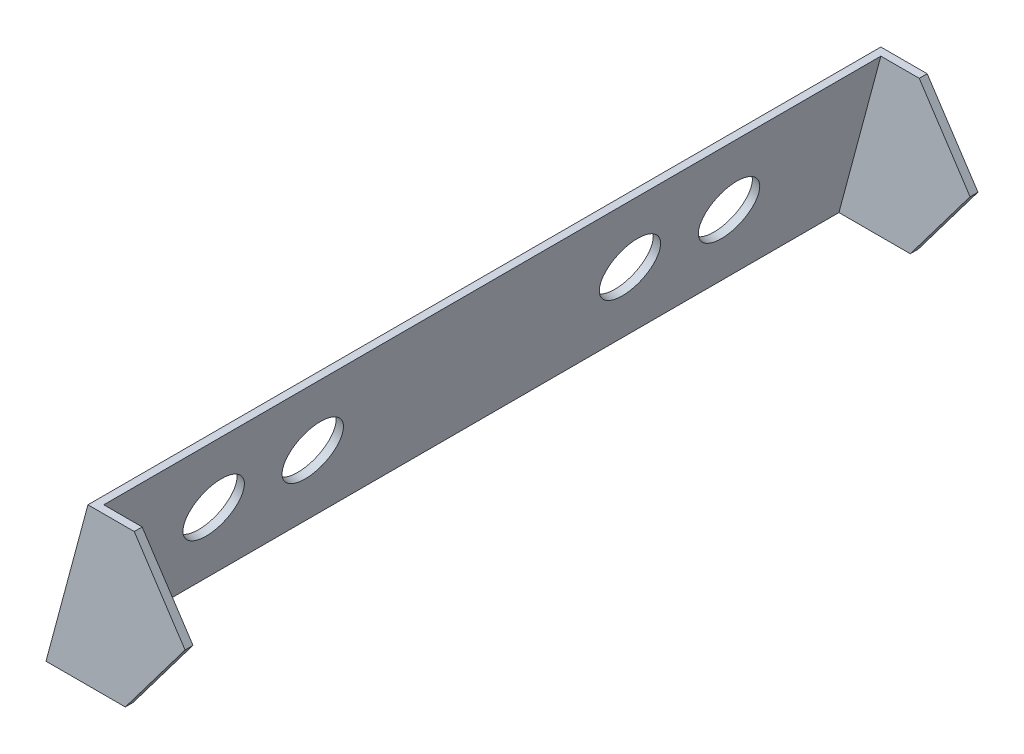
ISO-10303-21;
HEADER;
FILE_DESCRIPTION(('STEP AP214'),'2;1');
FILE_NAME('part.step','',(''),(''),'','','');
FILE_SCHEMA(('AUTOMOTIVE_DESIGN { 1 0 10303 214 1 1 1 1 }'));
ENDSEC;
DATA;
#1=APPLICATION_CONTEXT('core data for automotive mechanical design processes');
#2=APPLICATION_PROTOCOL_DEFINITION('international standard','automotive_design',2000,#1);
#3=PRODUCT_CONTEXT('',#1,'mechanical');
#4=PRODUCT('Part','Part','',(#3));
#5=PRODUCT_RELATED_PRODUCT_CATEGORY('part','',(#4));
#6=PRODUCT_DEFINITION_FORMATION('','',#4);
#7=PRODUCT_DEFINITION_CONTEXT('part definition',#1,'design');
#8=PRODUCT_DEFINITION('design','',#6,#7);
#9=PRODUCT_DEFINITION_SHAPE('','',#8);
#10=(LENGTH_UNIT() NAMED_UNIT(*) SI_UNIT(.MILLI.,.METRE.));
#11=(NAMED_UNIT(*) PLANE_ANGLE_UNIT() SI_UNIT($,.RADIAN.));
#12=(NAMED_UNIT(*) SI_UNIT($,.STERADIAN.) SOLID_ANGLE_UNIT());
#13=UNCERTAINTY_MEASURE_WITH_UNIT(LENGTH_MEASURE(1.E-05),#10,'distance_accuracy_value','');
#14=(GEOMETRIC_REPRESENTATION_CONTEXT(3) GLOBAL_UNCERTAINTY_ASSIGNED_CONTEXT((#13)) GLOBAL_UNIT_ASSIGNED_CONTEXT((#10,
#11,#12)) REPRESENTATION_CONTEXT('',''));
#15=CARTESIAN_POINT('',(0.,0.,0.));
#16=DIRECTION('',(0.,0.,1.));
#17=DIRECTION('',(1.,0.,0.));
#18=AXIS2_PLACEMENT_3D('',#15,#16,#17);
#19=CARTESIAN_POINT('',(0.,-20.,2.));
#20=DIRECTION('',(-0.965925826289069,0.258819045102518,0.));
#21=DIRECTION('',(-0.258819045102518,-0.965925826289069,0.));
#22=AXIS2_PLACEMENT_3D('',#19,#20,#21);
#23=PLANE('',#22);
#24=CARTESIAN_POINT('',(5.4210841017541,0.23176129985044,-163.));
#25=DIRECTION('',(-0.965925826289069,0.258819045102518,0.));
#26=DIRECTION('',(-0.258819045102518,-0.965925826289069,0.));
#27=AXIS2_PLACEMENT_3D('',#24,#25,#26);
#28=CIRCLE('',#27,7.50000000000001);
#29=CARTESIAN_POINT('',(3.47994126348521,-7.01268239731759,-163.));
#30=VERTEX_POINT('',#29);
#31=EDGE_CURVE('E138',#30,#30,#28,.T.);
#32=ORIENTED_EDGE('',*,*,#31,.F.);
#33=EDGE_LOOP('',(#32));
#34=FACE_BOUND('',#33,.T.);
#35=CARTESIAN_POINT('',(5.4210841017541,0.23176129985044,-33.));
#36=DIRECTION('',(-0.965925826289069,0.258819045102518,0.));
#37=DIRECTION('',(-0.258819045102518,-0.965925826289069,0.));
#38=AXIS2_PLACEMENT_3D('',#35,#36,#37);
#39=CIRCLE('',#38,7.50000000000001);
#40=CARTESIAN_POINT('',(3.47994126348521,-7.01268239731758,-33.));
#41=VERTEX_POINT('',#40);
#42=EDGE_CURVE('E239',#41,#41,#39,.T.);
#43=ORIENTED_EDGE('',*,*,#42,.F.);
#44=EDGE_LOOP('',(#43));
#45=FACE_BOUND('',#44,.T.);
#46=CARTESIAN_POINT('',(5.42108410175413,0.231761299850614,-138.));
#47=DIRECTION('',(-0.965925826289069,0.258819045102518,0.));
#48=DIRECTION('',(-0.258819045102518,-0.965925826289069,0.));
#49=AXIS2_PLACEMENT_3D('',#46,#47,#48);
#50=CIRCLE('',#49,7.50000000000001);
#51=CARTESIAN_POINT('',(3.47994126348524,-7.01268239731742,-138.));
#52=VERTEX_POINT('',#51);
#53=EDGE_CURVE('E243',#52,#52,#50,.T.);
#54=ORIENTED_EDGE('',*,*,#53,.F.);
#55=EDGE_LOOP('',(#54));
#56=FACE_BOUND('',#55,.T.);
#57=CARTESIAN_POINT('',(5.42108410175413,0.231761299850614,-58.));
#58=DIRECTION('',(-0.965925826289069,0.258819045102518,0.));
#59=DIRECTION('',(-0.258819045102518,-0.965925826289069,0.));
#60=AXIS2_PLACEMENT_3D('',#57,#58,#59);
#61=CIRCLE('',#60,7.50000000000001);
#62=CARTESIAN_POINT('',(3.47994126348524,-7.01268239731741,-58.));
#63=VERTEX_POINT('',#62);
#64=EDGE_CURVE('E246',#63,#63,#61,.T.);
#65=ORIENTED_EDGE('',*,*,#64,.F.);
#66=EDGE_LOOP('',(#65));
#67=FACE_BOUND('',#66,.T.);
#68=DIRECTION('',(0.,0.,-1.));
#69=VECTOR('',#68,1.);
#70=CARTESIAN_POINT('',(10.5742190110772,19.4635225997012,2.));
#71=LINE('',#70,#69);
#72=CARTESIAN_POINT('',(10.5742190110772,19.4635225997012,2.));
#73=VERTEX_POINT('',#72);
#74=CARTESIAN_POINT('',(10.5742190110772,19.4635225997012,-198.));
#75=VERTEX_POINT('',#74);
#76=EDGE_CURVE('E170',#73,#75,#71,.T.);
#77=ORIENTED_EDGE('',*,*,#76,.T.);
#78=DIRECTION('',(-0.258819045102518,-0.965925826289069,0.));
#79=VECTOR('',#78,1.);
#80=CARTESIAN_POINT('',(0.,-20.,-198.));
#81=LINE('',#80,#79);
#82=CARTESIAN_POINT('',(0.,-20.,-198.));
#83=VERTEX_POINT('',#82);
#84=EDGE_CURVE('E118',#75,#83,#81,.T.);
#85=ORIENTED_EDGE('',*,*,#84,.T.);
#86=DIRECTION('',(0.,0.,-1.));
#87=VECTOR('',#86,1.);
#88=CARTESIAN_POINT('',(0.,-20.,2.));
#89=LINE('',#88,#87);
#90=CARTESIAN_POINT('',(0.,-20.,2.));
#91=VERTEX_POINT('',#90);
#92=EDGE_CURVE('E112',#91,#83,#89,.T.);
#93=ORIENTED_EDGE('',*,*,#92,.F.);
#94=DIRECTION('',(0.258819045102518,0.965925826289069,0.));
#95=VECTOR('',#94,1.);
#96=CARTESIAN_POINT('',(0.,-20.,2.));
#97=LINE('',#96,#95);
#98=EDGE_CURVE('E157',#91,#73,#97,.T.);
#99=ORIENTED_EDGE('',*,*,#98,.T.);
#100=EDGE_LOOP('',(#77,#85,#93,#99));
#101=FACE_BOUND('',#100,.T.);
#102=ADVANCED_FACE('F33',(#34,#45,#56,#67,#101),#23,.T.);
#103=CARTESIAN_POINT('',(0.,-20.,2.));
#104=DIRECTION('',(0.,1.,0.));
#105=DIRECTION('',(0.,0.,1.));
#106=AXIS2_PLACEMENT_3D('',#103,#104,#105);
#107=PLANE('',#106);
#108=ORIENTED_EDGE('',*,*,#92,.T.);
#109=DIRECTION('',(1.,0.,0.));
#110=VECTOR('',#109,1.);
#111=CARTESIAN_POINT('',(2.,-20.,-198.));
#112=LINE('',#111,#110);
#113=CARTESIAN_POINT('',(20.,-20.,-198.));
#114=VERTEX_POINT('',#113);
#115=EDGE_CURVE('E106',#83,#114,#112,.T.);
#116=ORIENTED_EDGE('',*,*,#115,.T.);
#117=DIRECTION('',(0.,0.,1.));
#118=VECTOR('',#117,1.);
#119=CARTESIAN_POINT('',(20.,-20.,-198.));
#120=LINE('',#119,#118);
#121=CARTESIAN_POINT('',(20.,-20.,-196.));
#122=VERTEX_POINT('',#121);
#123=EDGE_CURVE('E109',#114,#122,#120,.T.);
#124=ORIENTED_EDGE('',*,*,#123,.T.);
#125=DIRECTION('',(1.,0.,0.));
#126=VECTOR('',#125,1.);
#127=CARTESIAN_POINT('',(0.,-20.,-196.));
#128=LINE('',#127,#126);
#129=CARTESIAN_POINT('',(2.,-20.,-196.));
#130=VERTEX_POINT('',#129);
#131=EDGE_CURVE('E141',#130,#122,#128,.T.);
#132=ORIENTED_EDGE('',*,*,#131,.F.);
#133=DIRECTION('',(0.,0.,1.));
#134=VECTOR('',#133,1.);
#135=CARTESIAN_POINT('',(2.,-20.,-198.));
#136=LINE('',#135,#134);
#137=CARTESIAN_POINT('',(2.,-20.,0.));
#138=VERTEX_POINT('',#137);
#139=EDGE_CURVE('E52',#130,#138,#136,.T.);
#140=ORIENTED_EDGE('',*,*,#139,.T.);
#141=DIRECTION('',(1.,0.,0.));
#142=VECTOR('',#141,1.);
#143=CARTESIAN_POINT('',(0.,-20.,0.));
#144=LINE('',#143,#142);
#145=CARTESIAN_POINT('',(20.,-20.,0.));
#146=VERTEX_POINT('',#145);
#147=EDGE_CURVE('E161',#138,#146,#144,.T.);
#148=ORIENTED_EDGE('',*,*,#147,.T.);
#149=DIRECTION('',(0.,0.,-1.));
#150=VECTOR('',#149,1.);
#151=CARTESIAN_POINT('',(20.,-20.,2.));
#152=LINE('',#151,#150);
#153=CARTESIAN_POINT('',(20.,-20.,2.));
#154=VERTEX_POINT('',#153);
#155=EDGE_CURVE('E180',#154,#146,#152,.T.);
#156=ORIENTED_EDGE('',*,*,#155,.F.);
#157=DIRECTION('',(1.,0.,0.));
#158=VECTOR('',#157,1.);
#159=CARTESIAN_POINT('',(0.,-20.,2.));
#160=LINE('',#159,#158);
#161=EDGE_CURVE('E168',#91,#154,#160,.T.);
#162=ORIENTED_EDGE('',*,*,#161,.F.);
#163=EDGE_LOOP('',(#108,#116,#124,#132,#140,#148,#156,#162));
#164=FACE_BOUND('',#163,.T.);
#165=ADVANCED_FACE('F108',(#164),#107,.F.);
#166=CARTESIAN_POINT('',(20.,-20.,2.));
#167=DIRECTION('',(-0.79853855454825,0.601943665885764,0.));
#168=DIRECTION('',(-0.601943665885764,-0.79853855454825,0.));
#169=AXIS2_PLACEMENT_3D('',#166,#167,#168);
#170=PLANE('',#169);
#171=DIRECTION('',(0.601943665885764,0.79853855454825,0.));
#172=VECTOR('',#171,1.);
#173=CARTESIAN_POINT('',(20.,-20.,0.));
#174=LINE('',#173,#172);
#175=CARTESIAN_POINT('',(35.0761328293359,0.,0.));
#176=VERTEX_POINT('',#175);
#177=EDGE_CURVE('E175',#146,#176,#174,.T.);
#178=ORIENTED_EDGE('',*,*,#177,.T.);
#179=DIRECTION('',(0.,0.,-1.));
#180=VECTOR('',#179,1.);
#181=CARTESIAN_POINT('',(35.0761328293359,0.,2.));
#182=LINE('',#181,#180);
#183=CARTESIAN_POINT('',(35.0761328293359,0.,2.));
#184=VERTEX_POINT('',#183);
#185=EDGE_CURVE('E183',#184,#176,#182,.T.);
#186=ORIENTED_EDGE('',*,*,#185,.F.);
#187=DIRECTION('',(0.601943665885764,0.79853855454825,0.));
#188=VECTOR('',#187,1.);
#189=CARTESIAN_POINT('',(20.,-20.,2.));
#190=LINE('',#189,#188);
#191=EDGE_CURVE('E166',#154,#184,#190,.T.);
#192=ORIENTED_EDGE('',*,*,#191,.F.);
#193=ORIENTED_EDGE('',*,*,#155,.T.);
#194=EDGE_LOOP('',(#178,#186,#192,#193));
#195=FACE_BOUND('',#194,.T.);
#196=ADVANCED_FACE('F198',(#195),#170,.F.);
#197=CARTESIAN_POINT('',(22.2565436344256,19.4635225997012,2.));
#198=DIRECTION('',(0.835128537813812,0.550054838474278,0.));
#199=DIRECTION('',(-0.550054838474278,0.835128537813812,0.));
#200=AXIS2_PLACEMENT_3D('',#197,#198,#199);
#201=PLANE('',#200);
#202=DIRECTION('',(0.550054838474278,-0.835128537813812,0.));
#203=VECTOR('',#202,1.);
#204=CARTESIAN_POINT('',(22.2565436344256,19.4635225997012,0.));
#205=LINE('',#204,#203);
#206=CARTESIAN_POINT('',(22.2565436344256,19.4635225997012,0.));
#207=VERTEX_POINT('',#206);
#208=EDGE_CURVE('E172',#207,#176,#205,.T.);
#209=ORIENTED_EDGE('',*,*,#208,.F.);
#210=DIRECTION('',(0.,0.,-1.));
#211=VECTOR('',#210,1.);
#212=CARTESIAN_POINT('',(22.2565436344256,19.4635225997012,2.));
#213=LINE('',#212,#211);
#214=CARTESIAN_POINT('',(22.2565436344256,19.4635225997012,2.));
#215=VERTEX_POINT('',#214);
#216=EDGE_CURVE('E185',#215,#207,#213,.T.);
#217=ORIENTED_EDGE('',*,*,#216,.F.);
#218=DIRECTION('',(0.550054838474278,-0.835128537813812,0.));
#219=VECTOR('',#218,1.);
#220=CARTESIAN_POINT('',(22.2565436344256,19.4635225997012,2.));
#221=LINE('',#220,#219);
#222=EDGE_CURVE('E163',#215,#184,#221,.T.);
#223=ORIENTED_EDGE('',*,*,#222,.T.);
#224=ORIENTED_EDGE('',*,*,#185,.T.);
#225=EDGE_LOOP('',(#209,#217,#223,#224));
#226=FACE_BOUND('',#225,.T.);
#227=ADVANCED_FACE('F290',(#226),#201,.T.);
#228=CARTESIAN_POINT('',(10.5742190110772,19.4635225997012,2.));
#229=DIRECTION('',(0.,1.,0.));
#230=DIRECTION('',(0.,0.,1.));
#231=AXIS2_PLACEMENT_3D('',#228,#229,#230);
#232=PLANE('',#231);
#233=DIRECTION('',(0.,0.,1.));
#234=VECTOR('',#233,1.);
#235=CARTESIAN_POINT('',(12.5742190110772,19.4635225997012,-198.));
#236=LINE('',#235,#234);
#237=CARTESIAN_POINT('',(12.5742190110772,19.4635225997012,-196.));
#238=VERTEX_POINT('',#237);
#239=CARTESIAN_POINT('',(12.5742190110772,19.4635225997012,0.));
#240=VERTEX_POINT('',#239);
#241=EDGE_CURVE('E153',#238,#240,#236,.T.);
#242=ORIENTED_EDGE('',*,*,#241,.F.);
#243=DIRECTION('',(1.,0.,0.));
#244=VECTOR('',#243,1.);
#245=CARTESIAN_POINT('',(10.5742190110772,19.4635225997012,-196.));
#246=LINE('',#245,#244);
#247=CARTESIAN_POINT('',(22.2565436344256,19.4635225997012,-196.));
#248=VERTEX_POINT('',#247);
#249=EDGE_CURVE('E132',#238,#248,#246,.T.);
#250=ORIENTED_EDGE('',*,*,#249,.T.);
#251=DIRECTION('',(0.,0.,1.));
#252=VECTOR('',#251,1.);
#253=CARTESIAN_POINT('',(22.2565436344256,19.4635225997012,-198.));
#254=LINE('',#253,#252);
#255=CARTESIAN_POINT('',(22.2565436344256,19.4635225997012,-198.));
#256=VERTEX_POINT('',#255);
#257=EDGE_CURVE('E146',#256,#248,#254,.T.);
#258=ORIENTED_EDGE('',*,*,#257,.F.);
#259=DIRECTION('',(-1.,0.,0.));
#260=VECTOR('',#259,1.);
#261=CARTESIAN_POINT('',(10.5742190110772,19.4635225997012,-198.));
#262=LINE('',#261,#260);
#263=EDGE_CURVE('E117',#256,#75,#262,.T.);
#264=ORIENTED_EDGE('',*,*,#263,.T.);
#265=ORIENTED_EDGE('',*,*,#76,.F.);
#266=DIRECTION('',(1.,0.,0.));
#267=VECTOR('',#266,1.);
#268=CARTESIAN_POINT('',(10.5742190110772,19.4635225997012,2.));
#269=LINE('',#268,#267);
#270=EDGE_CURVE('E160',#73,#215,#269,.T.);
#271=ORIENTED_EDGE('',*,*,#270,.T.);
#272=ORIENTED_EDGE('',*,*,#216,.T.);
#273=DIRECTION('',(1.,0.,0.));
#274=VECTOR('',#273,1.);
#275=CARTESIAN_POINT('',(10.5742190110772,19.4635225997012,0.));
#276=LINE('',#275,#274);
#277=EDGE_CURVE('E155',#240,#207,#276,.T.);
#278=ORIENTED_EDGE('',*,*,#277,.F.);
#279=EDGE_LOOP('',(#242,#250,#258,#264,#265,#271,#272,#278));
#280=FACE_BOUND('',#279,.T.);
#281=ADVANCED_FACE('F208',(#280),#232,.T.);
#282=CARTESIAN_POINT('',(0.,0.,2.));
#283=DIRECTION('',(0.,0.,-1.));
#284=DIRECTION('',(-1.,0.,0.));
#285=AXIS2_PLACEMENT_3D('',#282,#283,#284);
#286=PLANE('',#285);
#287=ORIENTED_EDGE('',*,*,#222,.F.);
#288=ORIENTED_EDGE('',*,*,#270,.F.);
#289=ORIENTED_EDGE('',*,*,#98,.F.);
#290=ORIENTED_EDGE('',*,*,#161,.T.);
#291=ORIENTED_EDGE('',*,*,#191,.T.);
#292=EDGE_LOOP('',(#287,#288,#289,#290,#291));
#293=FACE_BOUND('',#292,.T.);
#294=ADVANCED_FACE('F202',(#293),#286,.F.);
#295=CARTESIAN_POINT('',(0.,0.,0.));
#296=DIRECTION('',(0.,0.,-1.));
#297=DIRECTION('',(-1.,0.,0.));
#298=AXIS2_PLACEMENT_3D('',#295,#296,#297);
#299=PLANE('',#298);
#300=DIRECTION('',(-0.258819045102518,-0.965925826289069,0.));
#301=VECTOR('',#300,1.);
#302=CARTESIAN_POINT('',(6.86602540378439,-1.83974596215558,0.));
#303=LINE('',#302,#301);
#304=EDGE_CURVE('E40',#240,#138,#303,.T.);
#305=ORIENTED_EDGE('',*,*,#304,.F.);
#306=ORIENTED_EDGE('',*,*,#277,.T.);
#307=ORIENTED_EDGE('',*,*,#208,.T.);
#308=ORIENTED_EDGE('',*,*,#177,.F.);
#309=ORIENTED_EDGE('',*,*,#147,.F.);
#310=EDGE_LOOP('',(#305,#306,#307,#308,#309));
#311=FACE_BOUND('',#310,.T.);
#312=ADVANCED_FACE('F194',(#311),#299,.T.);
#313=CARTESIAN_POINT('',(12.5742190110772,19.4635225997012,-198.));
#314=DIRECTION('',(0.965925826289069,-0.258819045102518,0.));
#315=DIRECTION('',(0.258819045102518,0.965925826289069,0.));
#316=AXIS2_PLACEMENT_3D('',#313,#314,#315);
#317=PLANE('',#316);
#318=CARTESIAN_POINT('',(7.28710950553854,-0.268238700149546,-163.));
#319=DIRECTION('',(0.965925826289069,-0.258819045102518,0.));
#320=DIRECTION('',(-0.258819045102518,-0.965925826289069,0.));
#321=AXIS2_PLACEMENT_3D('',#318,#319,#320);
#322=CIRCLE('',#321,7.50000000000001);
#323=CARTESIAN_POINT('',(5.34596666726966,-7.51268239731758,-163.));
#324=VERTEX_POINT('',#323);
#325=EDGE_CURVE('E251',#324,#324,#322,.T.);
#326=ORIENTED_EDGE('',*,*,#325,.F.);
#327=EDGE_LOOP('',(#326));
#328=FACE_BOUND('',#327,.T.);
#329=CARTESIAN_POINT('',(7.28710950553854,-0.268238700149546,-33.));
#330=DIRECTION('',(0.965925826289069,-0.258819045102518,0.));
#331=DIRECTION('',(0.258819045102518,0.965925826289069,0.));
#332=AXIS2_PLACEMENT_3D('',#329,#330,#331);
#333=CIRCLE('',#332,7.50000000000001);
#334=CARTESIAN_POINT('',(9.22825234380743,6.97620499701848,-33.));
#335=VERTEX_POINT('',#334);
#336=EDGE_CURVE('E264',#335,#335,#333,.T.);
#337=ORIENTED_EDGE('',*,*,#336,.F.);
#338=EDGE_LOOP('',(#337));
#339=FACE_BOUND('',#338,.T.);
#340=CARTESIAN_POINT('',(7.28710950553859,-0.268238700149377,-138.));
#341=DIRECTION('',(0.965925826289069,-0.258819045102518,0.));
#342=DIRECTION('',(-0.258819045102518,-0.965925826289069,0.));
#343=AXIS2_PLACEMENT_3D('',#340,#341,#342);
#344=CIRCLE('',#343,7.50000000000001);
#345=CARTESIAN_POINT('',(5.3459666672697,-7.51268239731741,-138.));
#346=VERTEX_POINT('',#345);
#347=EDGE_CURVE('E267',#346,#346,#344,.T.);
#348=ORIENTED_EDGE('',*,*,#347,.F.);
#349=EDGE_LOOP('',(#348));
#350=FACE_BOUND('',#349,.T.);
#351=CARTESIAN_POINT('',(7.28710950553859,-0.268238700149377,-58.));
#352=DIRECTION('',(0.965925826289069,-0.258819045102518,0.));
#353=DIRECTION('',(0.258819045102518,0.965925826289069,0.));
#354=AXIS2_PLACEMENT_3D('',#351,#352,#353);
#355=CIRCLE('',#354,7.50000000000001);
#356=CARTESIAN_POINT('',(9.22825234380747,6.97620499701865,-58.));
#357=VERTEX_POINT('',#356);
#358=EDGE_CURVE('E247',#357,#357,#355,.T.);
#359=ORIENTED_EDGE('',*,*,#358,.F.);
#360=EDGE_LOOP('',(#359));
#361=FACE_BOUND('',#360,.T.);
#362=DIRECTION('',(-0.258819045102518,-0.965925826289069,0.));
#363=VECTOR('',#362,1.);
#364=CARTESIAN_POINT('',(12.5742190110772,19.4635225997012,-196.));
#365=LINE('',#364,#363);
#366=EDGE_CURVE('E11',#238,#130,#365,.T.);
#367=ORIENTED_EDGE('',*,*,#366,.F.);
#368=ORIENTED_EDGE('',*,*,#241,.T.);
#369=ORIENTED_EDGE('',*,*,#304,.T.);
#370=ORIENTED_EDGE('',*,*,#139,.F.);
#371=EDGE_LOOP('',(#367,#368,#369,#370));
#372=FACE_BOUND('',#371,.T.);
#373=ADVANCED_FACE('F190',(#328,#339,#350,#361,#372),#317,.T.);
#374=CARTESIAN_POINT('',(0.,0.,-198.));
#375=DIRECTION('',(0.,0.,-1.));
#376=DIRECTION('',(-1.,0.,0.));
#377=AXIS2_PLACEMENT_3D('',#374,#375,#376);
#378=PLANE('',#377);
#379=ORIENTED_EDGE('',*,*,#84,.F.);
#380=ORIENTED_EDGE('',*,*,#263,.F.);
#381=DIRECTION('',(0.550054838474278,-0.835128537813812,0.));
#382=VECTOR('',#381,1.);
#383=CARTESIAN_POINT('',(22.2565436344256,19.4635225997012,-198.));
#384=LINE('',#383,#382);
#385=CARTESIAN_POINT('',(35.0761328293359,0.,-198.));
#386=VERTEX_POINT('',#385);
#387=EDGE_CURVE('E127',#256,#386,#384,.T.);
#388=ORIENTED_EDGE('',*,*,#387,.T.);
#389=DIRECTION('',(0.601943665885764,0.79853855454825,0.));
#390=VECTOR('',#389,1.);
#391=CARTESIAN_POINT('',(20.,-20.,-198.));
#392=LINE('',#391,#390);
#393=EDGE_CURVE('E123',#114,#386,#392,.T.);
#394=ORIENTED_EDGE('',*,*,#393,.F.);
#395=ORIENTED_EDGE('',*,*,#115,.F.);
#396=EDGE_LOOP('',(#379,#380,#388,#394,#395));
#397=FACE_BOUND('',#396,.T.);
#398=ADVANCED_FACE('F129',(#397),#378,.T.);
#399=CARTESIAN_POINT('',(22.2565436344256,19.4635225997012,-198.));
#400=DIRECTION('',(-0.835128537813812,-0.550054838474278,0.));
#401=DIRECTION('',(0.550054838474278,-0.835128537813812,0.));
#402=AXIS2_PLACEMENT_3D('',#399,#400,#401);
#403=PLANE('',#402);
#404=DIRECTION('',(0.550054838474278,-0.835128537813812,0.));
#405=VECTOR('',#404,1.);
#406=CARTESIAN_POINT('',(22.2565436344256,19.4635225997012,-196.));
#407=LINE('',#406,#405);
#408=CARTESIAN_POINT('',(35.0761328293359,0.,-196.));
#409=VERTEX_POINT('',#408);
#410=EDGE_CURVE('E135',#248,#409,#407,.T.);
#411=ORIENTED_EDGE('',*,*,#410,.T.);
#412=DIRECTION('',(0.,0.,1.));
#413=VECTOR('',#412,1.);
#414=CARTESIAN_POINT('',(35.0761328293359,0.,-198.));
#415=LINE('',#414,#413);
#416=EDGE_CURVE('E126',#386,#409,#415,.T.);
#417=ORIENTED_EDGE('',*,*,#416,.F.);
#418=ORIENTED_EDGE('',*,*,#387,.F.);
#419=ORIENTED_EDGE('',*,*,#257,.T.);
#420=EDGE_LOOP('',(#411,#417,#418,#419));
#421=FACE_BOUND('',#420,.T.);
#422=ADVANCED_FACE('F212',(#421),#403,.F.);
#423=CARTESIAN_POINT('',(20.,-20.,-198.));
#424=DIRECTION('',(0.79853855454825,-0.601943665885764,0.));
#425=DIRECTION('',(0.601943665885764,0.79853855454825,0.));
#426=AXIS2_PLACEMENT_3D('',#423,#424,#425);
#427=PLANE('',#426);
#428=DIRECTION('',(0.601943665885764,0.79853855454825,0.));
#429=VECTOR('',#428,1.);
#430=CARTESIAN_POINT('',(20.,-20.,-196.));
#431=LINE('',#430,#429);
#432=EDGE_CURVE('E125',#122,#409,#431,.T.);
#433=ORIENTED_EDGE('',*,*,#432,.F.);
#434=ORIENTED_EDGE('',*,*,#123,.F.);
#435=ORIENTED_EDGE('',*,*,#393,.T.);
#436=ORIENTED_EDGE('',*,*,#416,.T.);
#437=EDGE_LOOP('',(#433,#434,#435,#436));
#438=FACE_BOUND('',#437,.T.);
#439=ADVANCED_FACE('F122',(#438),#427,.T.);
#440=CARTESIAN_POINT('',(0.,0.,-196.));
#441=DIRECTION('',(0.,0.,1.));
#442=DIRECTION('',(-1.,0.,0.));
#443=AXIS2_PLACEMENT_3D('',#440,#441,#442);
#444=PLANE('',#443);
#445=ORIENTED_EDGE('',*,*,#249,.F.);
#446=ORIENTED_EDGE('',*,*,#366,.T.);
#447=ORIENTED_EDGE('',*,*,#131,.T.);
#448=ORIENTED_EDGE('',*,*,#432,.T.);
#449=ORIENTED_EDGE('',*,*,#410,.F.);
#450=EDGE_LOOP('',(#445,#446,#447,#448,#449));
#451=FACE_BOUND('',#450,.T.);
#452=ADVANCED_FACE('F214',(#451),#444,.T.);
#453=CARTESIAN_POINT('',(-185.898055752275,51.4955703203542,-58.));
#454=DIRECTION('',(0.965925826289069,-0.258819045102518,0.));
#455=DIRECTION('',(0.258819045102518,0.965925826289069,0.));
#456=AXIS2_PLACEMENT_3D('',#453,#454,#455);
#457=CYLINDRICAL_SURFACE('',#456,7.50000000000001);
#458=ORIENTED_EDGE('',*,*,#64,.T.);
#459=EDGE_LOOP('',(#458));
#460=FACE_BOUND('',#459,.T.);
#461=ORIENTED_EDGE('',*,*,#358,.T.);
#462=EDGE_LOOP('',(#461));
#463=FACE_BOUND('',#462,.T.);
#464=ADVANCED_FACE('F216',(#460,#463),#457,.F.);
#465=CARTESIAN_POINT('',(-185.898055752275,51.4955703203542,-138.));
#466=DIRECTION('',(0.965925826289069,-0.258819045102518,0.));
#467=DIRECTION('',(0.258819045102518,0.965925826289069,0.));
#468=AXIS2_PLACEMENT_3D('',#465,#466,#467);
#469=CYLINDRICAL_SURFACE('',#468,7.50000000000001);
#470=ORIENTED_EDGE('',*,*,#53,.T.);
#471=EDGE_LOOP('',(#470));
#472=FACE_BOUND('',#471,.T.);
#473=ORIENTED_EDGE('',*,*,#347,.T.);
#474=EDGE_LOOP('',(#473));
#475=FACE_BOUND('',#474,.T.);
#476=ADVANCED_FACE('F222',(#472,#475),#469,.F.);
#477=CARTESIAN_POINT('',(-185.898055752275,51.495570320354,-33.));
#478=DIRECTION('',(0.965925826289069,-0.258819045102518,0.));
#479=DIRECTION('',(0.258819045102518,0.965925826289069,0.));
#480=AXIS2_PLACEMENT_3D('',#477,#478,#479);
#481=CYLINDRICAL_SURFACE('',#480,7.50000000000001);
#482=ORIENTED_EDGE('',*,*,#42,.T.);
#483=EDGE_LOOP('',(#482));
#484=FACE_BOUND('',#483,.T.);
#485=ORIENTED_EDGE('',*,*,#336,.T.);
#486=EDGE_LOOP('',(#485));
#487=FACE_BOUND('',#486,.T.);
#488=ADVANCED_FACE('F259',(#484,#487),#481,.F.);
#489=CARTESIAN_POINT('',(-185.898055752275,51.495570320354,-163.));
#490=DIRECTION('',(0.965925826289069,-0.258819045102518,0.));
#491=DIRECTION('',(0.258819045102518,0.965925826289069,0.));
#492=AXIS2_PLACEMENT_3D('',#489,#490,#491);
#493=CYLINDRICAL_SURFACE('',#492,7.50000000000001);
#494=ORIENTED_EDGE('',*,*,#31,.T.);
#495=EDGE_LOOP('',(#494));
#496=FACE_BOUND('',#495,.T.);
#497=ORIENTED_EDGE('',*,*,#325,.T.);
#498=EDGE_LOOP('',(#497));
#499=FACE_BOUND('',#498,.T.);
#500=ADVANCED_FACE('F256',(#496,#499),#493,.F.);
#501=CLOSED_SHELL('',(#102,#165,#196,#227,#281,#294,#312,#373,#398,#422,#439,#452,#464,#476,
#488,#500));
#502=MANIFOLD_SOLID_BREP('B2',#501);
#503=ADVANCED_BREP_SHAPE_REPRESENTATION('',(#18,#502),#14);
#504=SHAPE_DEFINITION_REPRESENTATION(#9,#503);
ENDSEC;
END-ISO-10303-21;
